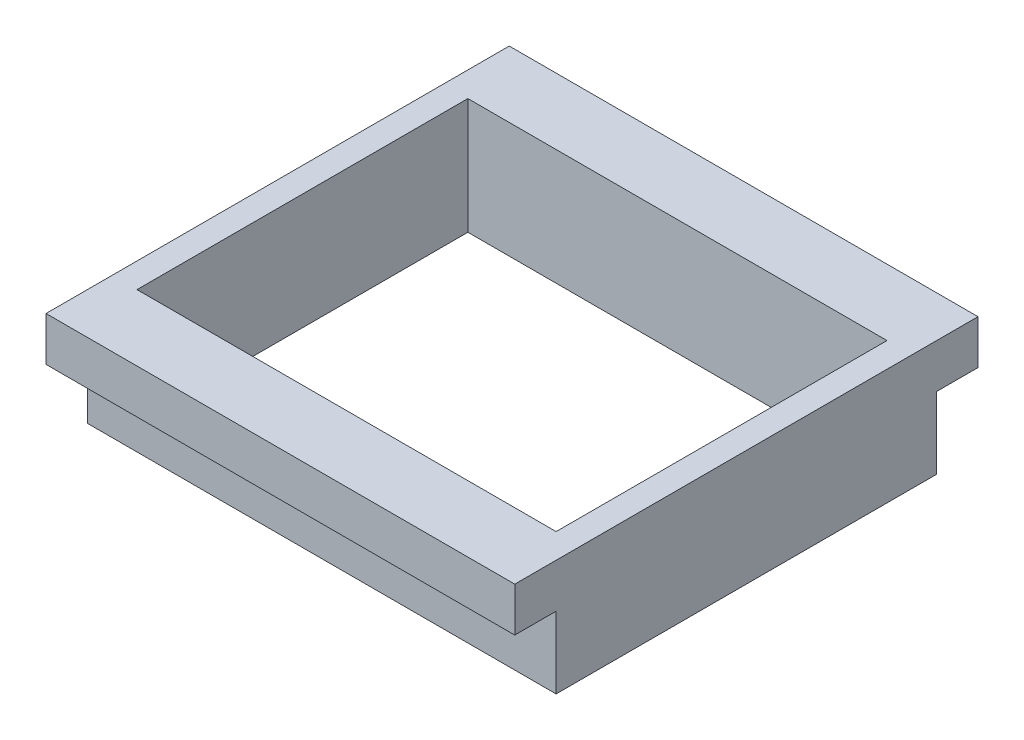
ISO-10303-21;
HEADER;
FILE_DESCRIPTION(('STEP AP214'),'2;1');
FILE_NAME('part.step','',(''),(''),'','','');
FILE_SCHEMA(('AUTOMOTIVE_DESIGN { 1 0 10303 214 1 1 1 1 }'));
ENDSEC;
DATA;
#1=APPLICATION_CONTEXT('core data for automotive mechanical design processes');
#2=APPLICATION_PROTOCOL_DEFINITION('international standard','automotive_design',2000,#1);
#3=PRODUCT_CONTEXT('',#1,'mechanical');
#4=PRODUCT('Part','Part','',(#3));
#5=PRODUCT_RELATED_PRODUCT_CATEGORY('part','',(#4));
#6=PRODUCT_DEFINITION_FORMATION('','',#4);
#7=PRODUCT_DEFINITION_CONTEXT('part definition',#1,'design');
#8=PRODUCT_DEFINITION('design','',#6,#7);
#9=PRODUCT_DEFINITION_SHAPE('','',#8);
#10=(LENGTH_UNIT() NAMED_UNIT(*) SI_UNIT(.MILLI.,.METRE.));
#11=(NAMED_UNIT(*) PLANE_ANGLE_UNIT() SI_UNIT($,.RADIAN.));
#12=(NAMED_UNIT(*) SI_UNIT($,.STERADIAN.) SOLID_ANGLE_UNIT());
#13=UNCERTAINTY_MEASURE_WITH_UNIT(LENGTH_MEASURE(1.E-05),#10,'distance_accuracy_value','');
#14=(GEOMETRIC_REPRESENTATION_CONTEXT(3) GLOBAL_UNCERTAINTY_ASSIGNED_CONTEXT((#13)) GLOBAL_UNIT_ASSIGNED_CONTEXT((#10,
#11,#12)) REPRESENTATION_CONTEXT('',''));
#15=CARTESIAN_POINT('',(0.,0.,0.));
#16=DIRECTION('',(0.,0.,1.));
#17=DIRECTION('',(1.,0.,0.));
#18=AXIS2_PLACEMENT_3D('',#15,#16,#17);
#19=CARTESIAN_POINT('',(0.,0.,0.));
#20=DIRECTION('',(0.,-1.,0.));
#21=DIRECTION('',(0.,0.,-1.));
#22=AXIS2_PLACEMENT_3D('',#19,#20,#21);
#23=PLANE('',#22);
#24=DIRECTION('',(0.,0.,1.));
#25=VECTOR('',#24,1.);
#26=CARTESIAN_POINT('',(-21.25,0.,17.25));
#27=LINE('',#26,#25);
#28=CARTESIAN_POINT('',(-21.25,0.,-17.25));
#29=VERTEX_POINT('',#28);
#30=CARTESIAN_POINT('',(-21.25,0.,17.25));
#31=VERTEX_POINT('',#30);
#32=EDGE_CURVE('E205',#29,#31,#27,.T.);
#33=ORIENTED_EDGE('',*,*,#32,.F.);
#34=DIRECTION('',(-1.,0.,0.));
#35=VECTOR('',#34,1.);
#36=CARTESIAN_POINT('',(-21.25,0.,-17.25));
#37=LINE('',#36,#35);
#38=CARTESIAN_POINT('',(21.25,0.,-17.25));
#39=VERTEX_POINT('',#38);
#40=EDGE_CURVE('E79',#39,#29,#37,.T.);
#41=ORIENTED_EDGE('',*,*,#40,.F.);
#42=DIRECTION('',(0.,0.,-1.));
#43=VECTOR('',#42,1.);
#44=CARTESIAN_POINT('',(21.25,0.,-17.25));
#45=LINE('',#44,#43);
#46=CARTESIAN_POINT('',(21.25,0.,17.25));
#47=VERTEX_POINT('',#46);
#48=EDGE_CURVE('E215',#47,#39,#45,.T.);
#49=ORIENTED_EDGE('',*,*,#48,.F.);
#50=DIRECTION('',(1.,0.,0.));
#51=VECTOR('',#50,1.);
#52=CARTESIAN_POINT('',(21.25,0.,17.25));
#53=LINE('',#52,#51);
#54=EDGE_CURVE('E213',#31,#47,#53,.T.);
#55=ORIENTED_EDGE('',*,*,#54,.F.);
#56=EDGE_LOOP('',(#33,#41,#49,#55));
#57=FACE_BOUND('',#56,.T.);
#58=DIRECTION('',(-1.,0.,0.));
#59=VECTOR('',#58,1.);
#60=CARTESIAN_POINT('',(-19.,0.,-15.));
#61=LINE('',#60,#59);
#62=CARTESIAN_POINT('',(19.,0.,-15.));
#63=VERTEX_POINT('',#62);
#64=CARTESIAN_POINT('',(-19.,0.,-15.));
#65=VERTEX_POINT('',#64);
#66=EDGE_CURVE('E141',#63,#65,#61,.T.);
#67=ORIENTED_EDGE('',*,*,#66,.T.);
#68=DIRECTION('',(0.,0.,1.));
#69=VECTOR('',#68,1.);
#70=CARTESIAN_POINT('',(-19.,0.,-15.));
#71=LINE('',#70,#69);
#72=CARTESIAN_POINT('',(-19.,0.,15.));
#73=VERTEX_POINT('',#72);
#74=EDGE_CURVE('E50',#65,#73,#71,.T.);
#75=ORIENTED_EDGE('',*,*,#74,.T.);
#76=DIRECTION('',(1.,0.,0.));
#77=VECTOR('',#76,1.);
#78=CARTESIAN_POINT('',(-19.,0.,15.));
#79=LINE('',#78,#77);
#80=CARTESIAN_POINT('',(19.,0.,15.));
#81=VERTEX_POINT('',#80);
#82=EDGE_CURVE('E193',#73,#81,#79,.T.);
#83=ORIENTED_EDGE('',*,*,#82,.T.);
#84=DIRECTION('',(0.,0.,-1.));
#85=VECTOR('',#84,1.);
#86=CARTESIAN_POINT('',(19.,0.,15.));
#87=LINE('',#86,#85);
#88=EDGE_CURVE('E196',#81,#63,#87,.T.);
#89=ORIENTED_EDGE('',*,*,#88,.T.);
#90=EDGE_LOOP('',(#67,#75,#83,#89));
#91=FACE_BOUND('',#90,.T.);
#92=ADVANCED_FACE('F35',(#57,#91),#23,.T.);
#93=CARTESIAN_POINT('',(-21.25,6.5,17.25));
#94=DIRECTION('',(1.,0.,0.));
#95=DIRECTION('',(0.,0.,-1.));
#96=AXIS2_PLACEMENT_3D('',#93,#94,#95);
#97=PLANE('',#96);
#98=ORIENTED_EDGE('',*,*,#32,.T.);
#99=DIRECTION('',(0.,-1.,0.));
#100=VECTOR('',#99,1.);
#101=CARTESIAN_POINT('',(-21.25,6.5,17.25));
#102=LINE('',#101,#100);
#103=CARTESIAN_POINT('',(-21.25,6.5,17.25));
#104=VERTEX_POINT('',#103);
#105=EDGE_CURVE('E11',#104,#31,#102,.T.);
#106=ORIENTED_EDGE('',*,*,#105,.F.);
#107=DIRECTION('',(0.,0.,1.));
#108=VECTOR('',#107,1.);
#109=CARTESIAN_POINT('',(-21.25,6.5,21.));
#110=LINE('',#109,#108);
#111=CARTESIAN_POINT('',(-21.25,6.5,21.));
#112=VERTEX_POINT('',#111);
#113=EDGE_CURVE('E172',#104,#112,#110,.T.);
#114=ORIENTED_EDGE('',*,*,#113,.T.);
#115=DIRECTION('',(0.,-1.,0.));
#116=VECTOR('',#115,1.);
#117=CARTESIAN_POINT('',(-21.25,10.5,21.));
#118=LINE('',#117,#116);
#119=CARTESIAN_POINT('',(-21.25,10.5,21.));
#120=VERTEX_POINT('',#119);
#121=EDGE_CURVE('E186',#120,#112,#118,.T.);
#122=ORIENTED_EDGE('',*,*,#121,.F.);
#123=DIRECTION('',(0.,0.,1.));
#124=VECTOR('',#123,1.);
#125=CARTESIAN_POINT('',(-21.25,10.5,21.));
#126=LINE('',#125,#124);
#127=CARTESIAN_POINT('',(-21.25,10.5,-21.));
#128=VERTEX_POINT('',#127);
#129=EDGE_CURVE('E162',#128,#120,#126,.T.);
#130=ORIENTED_EDGE('',*,*,#129,.F.);
#131=DIRECTION('',(0.,-1.,0.));
#132=VECTOR('',#131,1.);
#133=CARTESIAN_POINT('',(-21.25,10.5,-21.));
#134=LINE('',#133,#132);
#135=CARTESIAN_POINT('',(-21.25,6.5,-21.));
#136=VERTEX_POINT('',#135);
#137=EDGE_CURVE('E189',#128,#136,#134,.T.);
#138=ORIENTED_EDGE('',*,*,#137,.T.);
#139=CARTESIAN_POINT('',(-21.25,6.5,-17.25));
#140=VERTEX_POINT('',#139);
#141=EDGE_CURVE('E173',#136,#140,#110,.T.);
#142=ORIENTED_EDGE('',*,*,#141,.T.);
#143=DIRECTION('',(0.,-1.,0.));
#144=VECTOR('',#143,1.);
#145=CARTESIAN_POINT('',(-21.25,6.5,-17.25));
#146=LINE('',#145,#144);
#147=EDGE_CURVE('E210',#140,#29,#146,.T.);
#148=ORIENTED_EDGE('',*,*,#147,.T.);
#149=EDGE_LOOP('',(#98,#106,#114,#122,#130,#138,#142,#148));
#150=FACE_BOUND('',#149,.T.);
#151=ADVANCED_FACE('F37',(#150),#97,.F.);
#152=CARTESIAN_POINT('',(21.25,6.5,17.25));
#153=DIRECTION('',(0.,0.,-1.));
#154=DIRECTION('',(-1.,0.,0.));
#155=AXIS2_PLACEMENT_3D('',#152,#153,#154);
#156=PLANE('',#155);
#157=ORIENTED_EDGE('',*,*,#54,.T.);
#158=DIRECTION('',(0.,-1.,0.));
#159=VECTOR('',#158,1.);
#160=CARTESIAN_POINT('',(21.25,6.5,17.25));
#161=LINE('',#160,#159);
#162=CARTESIAN_POINT('',(21.25,6.5,17.25));
#163=VERTEX_POINT('',#162);
#164=EDGE_CURVE('E43',#163,#47,#161,.T.);
#165=ORIENTED_EDGE('',*,*,#164,.F.);
#166=DIRECTION('',(1.,0.,0.));
#167=VECTOR('',#166,1.);
#168=CARTESIAN_POINT('',(21.25,6.5,17.25));
#169=LINE('',#168,#167);
#170=EDGE_CURVE('E84',#104,#163,#169,.T.);
#171=ORIENTED_EDGE('',*,*,#170,.F.);
#172=ORIENTED_EDGE('',*,*,#105,.T.);
#173=EDGE_LOOP('',(#157,#165,#171,#172));
#174=FACE_BOUND('',#173,.T.);
#175=ADVANCED_FACE('F260',(#174),#156,.F.);
#176=CARTESIAN_POINT('',(21.25,6.5,-17.25));
#177=DIRECTION('',(-1.,0.,0.));
#178=DIRECTION('',(0.,0.,1.));
#179=AXIS2_PLACEMENT_3D('',#176,#177,#178);
#180=PLANE('',#179);
#181=ORIENTED_EDGE('',*,*,#48,.T.);
#182=DIRECTION('',(0.,-1.,0.));
#183=VECTOR('',#182,1.);
#184=CARTESIAN_POINT('',(21.25,6.5,-17.25));
#185=LINE('',#184,#183);
#186=CARTESIAN_POINT('',(21.25,6.5,-17.25));
#187=VERTEX_POINT('',#186);
#188=EDGE_CURVE('E59',#187,#39,#185,.T.);
#189=ORIENTED_EDGE('',*,*,#188,.F.);
#190=DIRECTION('',(0.,0.,-1.));
#191=VECTOR('',#190,1.);
#192=CARTESIAN_POINT('',(21.25,6.5,-21.));
#193=LINE('',#192,#191);
#194=CARTESIAN_POINT('',(21.25,6.5,-21.));
#195=VERTEX_POINT('',#194);
#196=EDGE_CURVE('E178',#187,#195,#193,.T.);
#197=ORIENTED_EDGE('',*,*,#196,.T.);
#198=DIRECTION('',(0.,-1.,0.));
#199=VECTOR('',#198,1.);
#200=CARTESIAN_POINT('',(21.25,10.5,-21.));
#201=LINE('',#200,#199);
#202=CARTESIAN_POINT('',(21.25,10.5,-21.));
#203=VERTEX_POINT('',#202);
#204=EDGE_CURVE('E169',#203,#195,#201,.T.);
#205=ORIENTED_EDGE('',*,*,#204,.F.);
#206=DIRECTION('',(0.,0.,-1.));
#207=VECTOR('',#206,1.);
#208=CARTESIAN_POINT('',(21.25,10.5,-21.));
#209=LINE('',#208,#207);
#210=CARTESIAN_POINT('',(21.25,10.5,21.));
#211=VERTEX_POINT('',#210);
#212=EDGE_CURVE('E167',#211,#203,#209,.T.);
#213=ORIENTED_EDGE('',*,*,#212,.F.);
#214=DIRECTION('',(0.,-1.,0.));
#215=VECTOR('',#214,1.);
#216=CARTESIAN_POINT('',(21.25,10.5,21.));
#217=LINE('',#216,#215);
#218=CARTESIAN_POINT('',(21.25,6.5,21.));
#219=VERTEX_POINT('',#218);
#220=EDGE_CURVE('E183',#211,#219,#217,.T.);
#221=ORIENTED_EDGE('',*,*,#220,.T.);
#222=EDGE_CURVE('E163',#219,#163,#193,.T.);
#223=ORIENTED_EDGE('',*,*,#222,.T.);
#224=ORIENTED_EDGE('',*,*,#164,.T.);
#225=EDGE_LOOP('',(#181,#189,#197,#205,#213,#221,#223,#224));
#226=FACE_BOUND('',#225,.T.);
#227=ADVANCED_FACE('F221',(#226),#180,.F.);
#228=CARTESIAN_POINT('',(-21.25,6.5,-17.25));
#229=DIRECTION('',(0.,0.,1.));
#230=DIRECTION('',(1.,0.,0.));
#231=AXIS2_PLACEMENT_3D('',#228,#229,#230);
#232=PLANE('',#231);
#233=ORIENTED_EDGE('',*,*,#40,.T.);
#234=ORIENTED_EDGE('',*,*,#147,.F.);
#235=DIRECTION('',(-1.,0.,0.));
#236=VECTOR('',#235,1.);
#237=CARTESIAN_POINT('',(-21.25,6.5,-17.25));
#238=LINE('',#237,#236);
#239=EDGE_CURVE('E207',#187,#140,#238,.T.);
#240=ORIENTED_EDGE('',*,*,#239,.F.);
#241=ORIENTED_EDGE('',*,*,#188,.T.);
#242=EDGE_LOOP('',(#233,#234,#240,#241));
#243=FACE_BOUND('',#242,.T.);
#244=ADVANCED_FACE('F228',(#243),#232,.F.);
#245=CARTESIAN_POINT('',(-19.,6.5,-15.));
#246=DIRECTION('',(1.,0.,0.));
#247=DIRECTION('',(0.,0.,-1.));
#248=AXIS2_PLACEMENT_3D('',#245,#246,#247);
#249=PLANE('',#248);
#250=ORIENTED_EDGE('',*,*,#74,.F.);
#251=DIRECTION('',(0.,-1.,0.));
#252=VECTOR('',#251,1.);
#253=CARTESIAN_POINT('',(-19.,6.5,-15.));
#254=LINE('',#253,#252);
#255=CARTESIAN_POINT('',(-19.,10.5,-15.));
#256=VERTEX_POINT('',#255);
#257=EDGE_CURVE('E131',#256,#65,#254,.T.);
#258=ORIENTED_EDGE('',*,*,#257,.F.);
#259=DIRECTION('',(0.,0.,1.));
#260=VECTOR('',#259,1.);
#261=CARTESIAN_POINT('',(-19.,10.5,-15.));
#262=LINE('',#261,#260);
#263=CARTESIAN_POINT('',(-19.,10.5,15.));
#264=VERTEX_POINT('',#263);
#265=EDGE_CURVE('E135',#256,#264,#262,.T.);
#266=ORIENTED_EDGE('',*,*,#265,.T.);
#267=DIRECTION('',(0.,-1.,0.));
#268=VECTOR('',#267,1.);
#269=CARTESIAN_POINT('',(-19.,6.5,15.));
#270=LINE('',#269,#268);
#271=EDGE_CURVE('E203',#264,#73,#270,.T.);
#272=ORIENTED_EDGE('',*,*,#271,.T.);
#273=EDGE_LOOP('',(#250,#258,#266,#272));
#274=FACE_BOUND('',#273,.T.);
#275=ADVANCED_FACE('F133',(#274),#249,.T.);
#276=CARTESIAN_POINT('',(-19.,6.5,15.));
#277=DIRECTION('',(0.,0.,-1.));
#278=DIRECTION('',(-1.,0.,0.));
#279=AXIS2_PLACEMENT_3D('',#276,#277,#278);
#280=PLANE('',#279);
#281=ORIENTED_EDGE('',*,*,#82,.F.);
#282=ORIENTED_EDGE('',*,*,#271,.F.);
#283=DIRECTION('',(1.,0.,0.));
#284=VECTOR('',#283,1.);
#285=CARTESIAN_POINT('',(-19.,10.5,15.));
#286=LINE('',#285,#284);
#287=CARTESIAN_POINT('',(19.,10.5,15.));
#288=VERTEX_POINT('',#287);
#289=EDGE_CURVE('E152',#264,#288,#286,.T.);
#290=ORIENTED_EDGE('',*,*,#289,.T.);
#291=DIRECTION('',(0.,-1.,0.));
#292=VECTOR('',#291,1.);
#293=CARTESIAN_POINT('',(19.,6.5,15.));
#294=LINE('',#293,#292);
#295=EDGE_CURVE('E201',#288,#81,#294,.T.);
#296=ORIENTED_EDGE('',*,*,#295,.T.);
#297=EDGE_LOOP('',(#281,#282,#290,#296));
#298=FACE_BOUND('',#297,.T.);
#299=ADVANCED_FACE('F286',(#298),#280,.T.);
#300=CARTESIAN_POINT('',(19.,6.5,15.));
#301=DIRECTION('',(-1.,0.,0.));
#302=DIRECTION('',(0.,0.,1.));
#303=AXIS2_PLACEMENT_3D('',#300,#301,#302);
#304=PLANE('',#303);
#305=ORIENTED_EDGE('',*,*,#88,.F.);
#306=ORIENTED_EDGE('',*,*,#295,.F.);
#307=DIRECTION('',(0.,0.,-1.));
#308=VECTOR('',#307,1.);
#309=CARTESIAN_POINT('',(19.,10.5,15.));
#310=LINE('',#309,#308);
#311=CARTESIAN_POINT('',(19.,10.5,-15.));
#312=VERTEX_POINT('',#311);
#313=EDGE_CURVE('E154',#288,#312,#310,.T.);
#314=ORIENTED_EDGE('',*,*,#313,.T.);
#315=DIRECTION('',(0.,-1.,0.));
#316=VECTOR('',#315,1.);
#317=CARTESIAN_POINT('',(19.,6.5,-15.));
#318=LINE('',#317,#316);
#319=EDGE_CURVE('E140',#312,#63,#318,.T.);
#320=ORIENTED_EDGE('',*,*,#319,.T.);
#321=EDGE_LOOP('',(#305,#306,#314,#320));
#322=FACE_BOUND('',#321,.T.);
#323=ADVANCED_FACE('F292',(#322),#304,.T.);
#324=CARTESIAN_POINT('',(-19.,6.5,-15.));
#325=DIRECTION('',(0.,0.,1.));
#326=DIRECTION('',(1.,0.,0.));
#327=AXIS2_PLACEMENT_3D('',#324,#325,#326);
#328=PLANE('',#327);
#329=ORIENTED_EDGE('',*,*,#66,.F.);
#330=ORIENTED_EDGE('',*,*,#319,.F.);
#331=DIRECTION('',(-1.,0.,0.));
#332=VECTOR('',#331,1.);
#333=CARTESIAN_POINT('',(19.,10.5,-15.));
#334=LINE('',#333,#332);
#335=EDGE_CURVE('E144',#312,#256,#334,.T.);
#336=ORIENTED_EDGE('',*,*,#335,.T.);
#337=ORIENTED_EDGE('',*,*,#257,.T.);
#338=EDGE_LOOP('',(#329,#330,#336,#337));
#339=FACE_BOUND('',#338,.T.);
#340=ADVANCED_FACE('F145',(#339),#328,.T.);
#341=CARTESIAN_POINT('',(0.,6.5,0.));
#342=DIRECTION('',(0.,-1.,0.));
#343=DIRECTION('',(0.,0.,-1.));
#344=AXIS2_PLACEMENT_3D('',#341,#342,#343);
#345=PLANE('',#344);
#346=ORIENTED_EDGE('',*,*,#113,.F.);
#347=ORIENTED_EDGE('',*,*,#170,.T.);
#348=ORIENTED_EDGE('',*,*,#222,.F.);
#349=DIRECTION('',(1.,0.,0.));
#350=VECTOR('',#349,1.);
#351=CARTESIAN_POINT('',(21.25,6.5,21.));
#352=LINE('',#351,#350);
#353=EDGE_CURVE('E176',#112,#219,#352,.T.);
#354=ORIENTED_EDGE('',*,*,#353,.F.);
#355=EDGE_LOOP('',(#346,#347,#348,#354));
#356=FACE_BOUND('',#355,.T.);
#357=ADVANCED_FACE('F246',(#356),#345,.T.);
#358=CARTESIAN_POINT('',(0.,10.5,0.));
#359=DIRECTION('',(0.,-1.,0.));
#360=DIRECTION('',(0.,0.,-1.));
#361=AXIS2_PLACEMENT_3D('',#358,#359,#360);
#362=PLANE('',#361);
#363=DIRECTION('',(-1.,0.,0.));
#364=VECTOR('',#363,1.);
#365=CARTESIAN_POINT('',(-21.25,10.5,-21.));
#366=LINE('',#365,#364);
#367=EDGE_CURVE('E159',#203,#128,#366,.T.);
#368=ORIENTED_EDGE('',*,*,#367,.T.);
#369=ORIENTED_EDGE('',*,*,#129,.T.);
#370=DIRECTION('',(1.,0.,0.));
#371=VECTOR('',#370,1.);
#372=CARTESIAN_POINT('',(21.25,10.5,21.));
#373=LINE('',#372,#371);
#374=EDGE_CURVE('E165',#120,#211,#373,.T.);
#375=ORIENTED_EDGE('',*,*,#374,.T.);
#376=ORIENTED_EDGE('',*,*,#212,.T.);
#377=EDGE_LOOP('',(#368,#369,#375,#376));
#378=FACE_BOUND('',#377,.T.);
#379=ORIENTED_EDGE('',*,*,#335,.F.);
#380=ORIENTED_EDGE('',*,*,#313,.F.);
#381=ORIENTED_EDGE('',*,*,#289,.F.);
#382=ORIENTED_EDGE('',*,*,#265,.F.);
#383=EDGE_LOOP('',(#379,#380,#381,#382));
#384=FACE_BOUND('',#383,.T.);
#385=ADVANCED_FACE('F150',(#378,#384),#362,.F.);
#386=ORIENTED_EDGE('',*,*,#196,.F.);
#387=ORIENTED_EDGE('',*,*,#239,.T.);
#388=ORIENTED_EDGE('',*,*,#141,.F.);
#389=DIRECTION('',(-1.,0.,0.));
#390=VECTOR('',#389,1.);
#391=CARTESIAN_POINT('',(-21.25,6.5,-21.));
#392=LINE('',#391,#390);
#393=EDGE_CURVE('E158',#195,#136,#392,.T.);
#394=ORIENTED_EDGE('',*,*,#393,.F.);
#395=EDGE_LOOP('',(#386,#387,#388,#394));
#396=FACE_BOUND('',#395,.T.);
#397=ADVANCED_FACE('F231',(#396),#345,.T.);
#398=CARTESIAN_POINT('',(-21.25,10.5,-21.));
#399=DIRECTION('',(0.,0.,1.));
#400=DIRECTION('',(1.,0.,0.));
#401=AXIS2_PLACEMENT_3D('',#398,#399,#400);
#402=PLANE('',#401);
#403=ORIENTED_EDGE('',*,*,#393,.T.);
#404=ORIENTED_EDGE('',*,*,#137,.F.);
#405=ORIENTED_EDGE('',*,*,#367,.F.);
#406=ORIENTED_EDGE('',*,*,#204,.T.);
#407=EDGE_LOOP('',(#403,#404,#405,#406));
#408=FACE_BOUND('',#407,.T.);
#409=ADVANCED_FACE('F237',(#408),#402,.F.);
#410=CARTESIAN_POINT('',(21.25,10.5,21.));
#411=DIRECTION('',(0.,0.,-1.));
#412=DIRECTION('',(-1.,0.,0.));
#413=AXIS2_PLACEMENT_3D('',#410,#411,#412);
#414=PLANE('',#413);
#415=ORIENTED_EDGE('',*,*,#353,.T.);
#416=ORIENTED_EDGE('',*,*,#220,.F.);
#417=ORIENTED_EDGE('',*,*,#374,.F.);
#418=ORIENTED_EDGE('',*,*,#121,.T.);
#419=EDGE_LOOP('',(#415,#416,#417,#418));
#420=FACE_BOUND('',#419,.T.);
#421=ADVANCED_FACE('F247',(#420),#414,.F.);
#422=CLOSED_SHELL('',(#92,#151,#175,#227,#244,#275,#299,#323,#340,#357,#385,#397,#409,#421));
#423=MANIFOLD_SOLID_BREP('B2',#422);
#424=ADVANCED_BREP_SHAPE_REPRESENTATION('',(#18,#423),#14);
#425=SHAPE_DEFINITION_REPRESENTATION(#9,#424);
ENDSEC;
END-ISO-10303-21;
